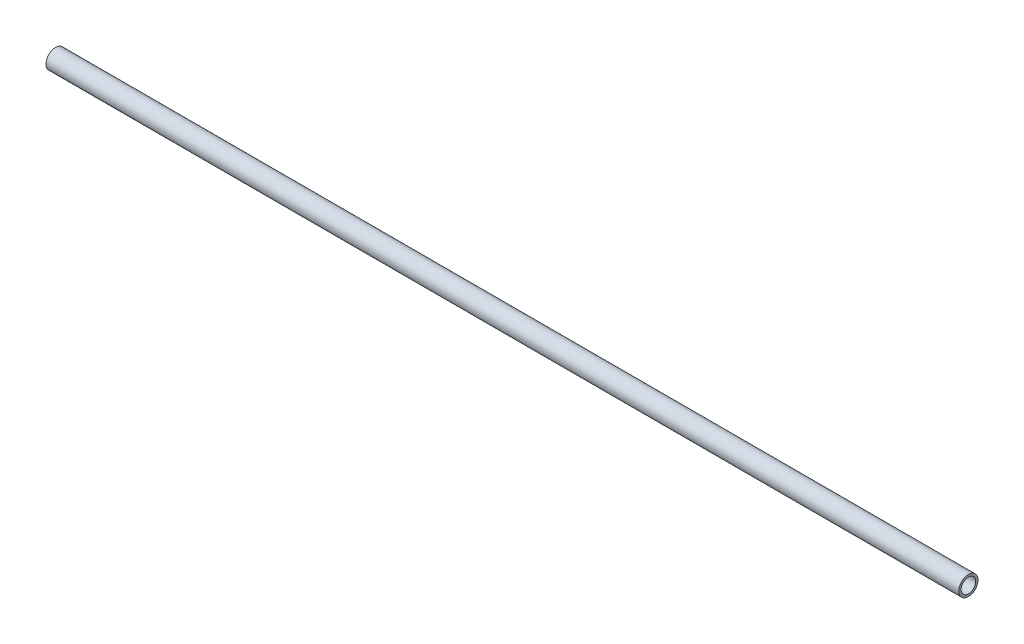
ISO-10303-21;
HEADER;
FILE_DESCRIPTION(('STEP AP214'),'2;1');
FILE_NAME('part.step','',(''),(''),'','','');
FILE_SCHEMA(('AUTOMOTIVE_DESIGN { 1 0 10303 214 1 1 1 1 }'));
ENDSEC;
DATA;
#1=APPLICATION_CONTEXT('core data for automotive mechanical design processes');
#2=APPLICATION_PROTOCOL_DEFINITION('international standard','automotive_design',2000,#1);
#3=PRODUCT_CONTEXT('',#1,'mechanical');
#4=PRODUCT('Part','Part','',(#3));
#5=PRODUCT_RELATED_PRODUCT_CATEGORY('part','',(#4));
#6=PRODUCT_DEFINITION_FORMATION('','',#4);
#7=PRODUCT_DEFINITION_CONTEXT('part definition',#1,'design');
#8=PRODUCT_DEFINITION('design','',#6,#7);
#9=PRODUCT_DEFINITION_SHAPE('','',#8);
#10=(LENGTH_UNIT() NAMED_UNIT(*) SI_UNIT(.MILLI.,.METRE.));
#11=(NAMED_UNIT(*) PLANE_ANGLE_UNIT() SI_UNIT($,.RADIAN.));
#12=(NAMED_UNIT(*) SI_UNIT($,.STERADIAN.) SOLID_ANGLE_UNIT());
#13=UNCERTAINTY_MEASURE_WITH_UNIT(LENGTH_MEASURE(1.E-05),#10,'distance_accuracy_value','');
#14=(GEOMETRIC_REPRESENTATION_CONTEXT(3) GLOBAL_UNCERTAINTY_ASSIGNED_CONTEXT((#13)) GLOBAL_UNIT_ASSIGNED_CONTEXT((#10,
#11,#12)) REPRESENTATION_CONTEXT('',''));
#15=CARTESIAN_POINT('',(0.,0.,0.));
#16=DIRECTION('',(0.,0.,1.));
#17=DIRECTION('',(1.,0.,0.));
#18=AXIS2_PLACEMENT_3D('',#15,#16,#17);
#19=CARTESIAN_POINT('',(1210.,0.,0.));
#20=DIRECTION('',(1.,0.,0.));
#21=DIRECTION('',(0.,0.,-1.));
#22=AXIS2_PLACEMENT_3D('',#19,#20,#21);
#23=PLANE('',#22);
#24=CARTESIAN_POINT('',(1210.,0.,0.));
#25=DIRECTION('',(1.,0.,0.));
#26=DIRECTION('',(0.,0.,-1.));
#27=AXIS2_PLACEMENT_3D('',#24,#25,#26);
#28=CIRCLE('',#27,12.7);
#29=CARTESIAN_POINT('',(1210.,0.,-12.7));
#30=VERTEX_POINT('',#29);
#31=EDGE_CURVE('E10',#30,#30,#28,.T.);
#32=ORIENTED_EDGE('',*,*,#31,.T.);
#33=EDGE_LOOP('',(#32));
#34=FACE_BOUND('',#33,.T.);
#35=CARTESIAN_POINT('',(1210.,0.,0.));
#36=DIRECTION('',(1.,0.,0.));
#37=DIRECTION('',(0.,0.,-1.));
#38=AXIS2_PLACEMENT_3D('',#35,#36,#37);
#39=CIRCLE('',#38,9.652);
#40=CARTESIAN_POINT('',(1210.,0.,-9.652));
#41=VERTEX_POINT('',#40);
#42=EDGE_CURVE('E45',#41,#41,#39,.T.);
#43=ORIENTED_EDGE('',*,*,#42,.F.);
#44=EDGE_LOOP('',(#43));
#45=FACE_BOUND('',#44,.T.);
#46=ADVANCED_FACE('F34',(#34,#45),#23,.T.);
#47=CARTESIAN_POINT('',(0.,0.,0.));
#48=DIRECTION('',(1.,0.,0.));
#49=DIRECTION('',(0.,0.,-1.));
#50=AXIS2_PLACEMENT_3D('',#47,#48,#49);
#51=PLANE('',#50);
#52=CARTESIAN_POINT('',(0.,0.,0.));
#53=DIRECTION('',(1.,0.,0.));
#54=DIRECTION('',(0.,0.,-1.));
#55=AXIS2_PLACEMENT_3D('',#52,#53,#54);
#56=CIRCLE('',#55,12.7);
#57=CARTESIAN_POINT('',(0.,0.,-12.7));
#58=VERTEX_POINT('',#57);
#59=EDGE_CURVE('E38',#58,#58,#56,.T.);
#60=ORIENTED_EDGE('',*,*,#59,.F.);
#61=EDGE_LOOP('',(#60));
#62=FACE_BOUND('',#61,.T.);
#63=CARTESIAN_POINT('',(0.,0.,0.));
#64=DIRECTION('',(1.,0.,0.));
#65=DIRECTION('',(0.,0.,-1.));
#66=AXIS2_PLACEMENT_3D('',#63,#64,#65);
#67=CIRCLE('',#66,9.652);
#68=CARTESIAN_POINT('',(0.,0.,-9.652));
#69=VERTEX_POINT('',#68);
#70=EDGE_CURVE('E47',#69,#69,#67,.T.);
#71=ORIENTED_EDGE('',*,*,#70,.T.);
#72=EDGE_LOOP('',(#71));
#73=FACE_BOUND('',#72,.T.);
#74=ADVANCED_FACE('F57',(#62,#73),#51,.F.);
#75=CARTESIAN_POINT('',(1210.,0.,0.));
#76=DIRECTION('',(-1.,0.,0.));
#77=DIRECTION('',(0.,0.,1.));
#78=AXIS2_PLACEMENT_3D('',#75,#76,#77);
#79=CYLINDRICAL_SURFACE('',#78,12.7);
#80=ORIENTED_EDGE('',*,*,#31,.F.);
#81=EDGE_LOOP('',(#80));
#82=FACE_BOUND('',#81,.T.);
#83=ORIENTED_EDGE('',*,*,#59,.T.);
#84=EDGE_LOOP('',(#83));
#85=FACE_BOUND('',#84,.T.);
#86=ADVANCED_FACE('F36',(#82,#85),#79,.T.);
#87=CARTESIAN_POINT('',(1210.,0.,0.));
#88=DIRECTION('',(-1.,0.,0.));
#89=DIRECTION('',(0.,0.,1.));
#90=AXIS2_PLACEMENT_3D('',#87,#88,#89);
#91=CYLINDRICAL_SURFACE('',#90,9.652);
#92=ORIENTED_EDGE('',*,*,#42,.T.);
#93=EDGE_LOOP('',(#92));
#94=FACE_BOUND('',#93,.T.);
#95=ORIENTED_EDGE('',*,*,#70,.F.);
#96=EDGE_LOOP('',(#95));
#97=FACE_BOUND('',#96,.T.);
#98=ADVANCED_FACE('F53',(#94,#97),#91,.F.);
#99=CLOSED_SHELL('',(#46,#74,#86,#98));
#100=MANIFOLD_SOLID_BREP('B2',#99);
#101=ADVANCED_BREP_SHAPE_REPRESENTATION('',(#18,#100),#14);
#102=SHAPE_DEFINITION_REPRESENTATION(#9,#101);
ENDSEC;
END-ISO-10303-21;
